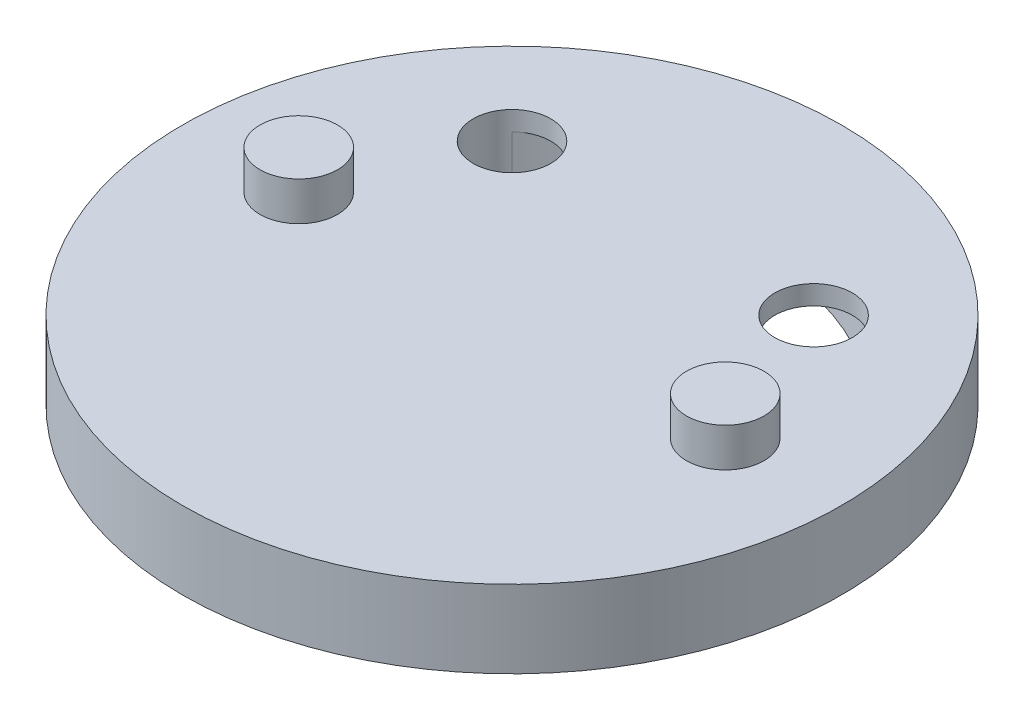
ISO-10303-21;
HEADER;
FILE_DESCRIPTION(('STEP AP214'),'2;1');
FILE_NAME('part.step','',(''),(''),'','','');
FILE_SCHEMA(('AUTOMOTIVE_DESIGN { 1 0 10303 214 1 1 1 1 }'));
ENDSEC;
DATA;
#1=APPLICATION_CONTEXT('core data for automotive mechanical design processes');
#2=APPLICATION_PROTOCOL_DEFINITION('international standard','automotive_design',2000,#1);
#3=PRODUCT_CONTEXT('',#1,'mechanical');
#4=PRODUCT('Part','Part','',(#3));
#5=PRODUCT_RELATED_PRODUCT_CATEGORY('part','',(#4));
#6=PRODUCT_DEFINITION_FORMATION('','',#4);
#7=PRODUCT_DEFINITION_CONTEXT('part definition',#1,'design');
#8=PRODUCT_DEFINITION('design','',#6,#7);
#9=PRODUCT_DEFINITION_SHAPE('','',#8);
#10=(LENGTH_UNIT() NAMED_UNIT(*) SI_UNIT(.MILLI.,.METRE.));
#11=(NAMED_UNIT(*) PLANE_ANGLE_UNIT() SI_UNIT($,.RADIAN.));
#12=(NAMED_UNIT(*) SI_UNIT($,.STERADIAN.) SOLID_ANGLE_UNIT());
#13=UNCERTAINTY_MEASURE_WITH_UNIT(LENGTH_MEASURE(1.E-05),#10,'distance_accuracy_value','');
#14=(GEOMETRIC_REPRESENTATION_CONTEXT(3) GLOBAL_UNCERTAINTY_ASSIGNED_CONTEXT((#13)) GLOBAL_UNIT_ASSIGNED_CONTEXT((#10,
#11,#12)) REPRESENTATION_CONTEXT('',''));
#15=CARTESIAN_POINT('',(0.,0.,0.));
#16=DIRECTION('',(0.,0.,1.));
#17=DIRECTION('',(1.,0.,0.));
#18=AXIS2_PLACEMENT_3D('',#15,#16,#17);
#19=CARTESIAN_POINT('',(0.,0.,0.));
#20=DIRECTION('',(0.,1.,0.));
#21=DIRECTION('',(0.,0.,1.));
#22=AXIS2_PLACEMENT_3D('',#19,#20,#21);
#23=PLANE('',#22);
#24=CARTESIAN_POINT('',(0.,0.,0.));
#25=DIRECTION('',(0.,1.,0.));
#26=DIRECTION('',(0.,0.,1.));
#27=AXIS2_PLACEMENT_3D('',#24,#25,#26);
#28=CIRCLE('',#27,17.);
#29=CARTESIAN_POINT('',(0.,0.,17.));
#30=VERTEX_POINT('',#29);
#31=EDGE_CURVE('E173',#30,#30,#28,.T.);
#32=ORIENTED_EDGE('',*,*,#31,.F.);
#33=EDGE_LOOP('',(#32));
#34=FACE_BOUND('',#33,.T.);
#35=CARTESIAN_POINT('',(0.,0.,0.));
#36=DIRECTION('',(0.,1.,0.));
#37=DIRECTION('',(0.,0.,1.));
#38=AXIS2_PLACEMENT_3D('',#35,#36,#37);
#39=CIRCLE('',#38,9.);
#40=CARTESIAN_POINT('',(-6.36396103067892,0.,6.36396103067893));
#41=VERTEX_POINT('',#40);
#42=CARTESIAN_POINT('',(6.36396103067892,0.,6.36396103067893));
#43=VERTEX_POINT('',#42);
#44=EDGE_CURVE('E142',#41,#43,#39,.T.);
#45=ORIENTED_EDGE('',*,*,#44,.F.);
#46=CARTESIAN_POINT('',(-7.77817459305201,0.,7.77817459305203));
#47=DIRECTION('',(0.,-1.,0.));
#48=DIRECTION('',(0.,0.,1.));
#49=AXIS2_PLACEMENT_3D('',#46,#47,#48);
#50=CIRCLE('',#49,2.);
#51=CARTESIAN_POINT('',(-9.19238815542511,0.,9.19238815542512));
#52=VERTEX_POINT('',#51);
#53=EDGE_CURVE('E62',#52,#41,#50,.T.);
#54=ORIENTED_EDGE('',*,*,#53,.F.);
#55=CARTESIAN_POINT('',(0.,0.,0.));
#56=DIRECTION('',(0.,-1.,0.));
#57=DIRECTION('',(0.,0.,1.));
#58=AXIS2_PLACEMENT_3D('',#55,#56,#57);
#59=CIRCLE('',#58,13.);
#60=CARTESIAN_POINT('',(9.1923881554251,0.,9.19238815542514));
#61=VERTEX_POINT('',#60);
#62=EDGE_CURVE('E131',#61,#52,#59,.T.);
#63=ORIENTED_EDGE('',*,*,#62,.F.);
#64=CARTESIAN_POINT('',(7.77817459305201,0.,7.77817459305203));
#65=DIRECTION('',(0.,-1.,0.));
#66=DIRECTION('',(0.,0.,1.));
#67=AXIS2_PLACEMENT_3D('',#64,#65,#66);
#68=CIRCLE('',#67,2.);
#69=EDGE_CURVE('E145',#43,#61,#68,.T.);
#70=ORIENTED_EDGE('',*,*,#69,.F.);
#71=EDGE_LOOP('',(#45,#54,#63,#70));
#72=FACE_BOUND('',#71,.T.);
#73=CARTESIAN_POINT('',(0.,0.,0.));
#74=DIRECTION('',(0.,-1.,0.));
#75=DIRECTION('',(0.,0.,-1.));
#76=AXIS2_PLACEMENT_3D('',#73,#74,#75);
#77=CIRCLE('',#76,13.);
#78=CARTESIAN_POINT('',(-9.19238815542511,0.,-9.19238815542512));
#79=VERTEX_POINT('',#78);
#80=CARTESIAN_POINT('',(9.1923881554251,0.,-9.19238815542514));
#81=VERTEX_POINT('',#80);
#82=EDGE_CURVE('E217',#79,#81,#77,.T.);
#83=ORIENTED_EDGE('',*,*,#82,.F.);
#84=CARTESIAN_POINT('',(-7.77817459305201,0.,-7.77817459305203));
#85=DIRECTION('',(0.,-1.,0.));
#86=DIRECTION('',(0.,0.,-1.));
#87=AXIS2_PLACEMENT_3D('',#84,#85,#86);
#88=CIRCLE('',#87,2.);
#89=CARTESIAN_POINT('',(-6.36396103067892,0.,-6.36396103067893));
#90=VERTEX_POINT('',#89);
#91=EDGE_CURVE('E119',#90,#79,#88,.T.);
#92=ORIENTED_EDGE('',*,*,#91,.F.);
#93=CARTESIAN_POINT('',(0.,0.,0.));
#94=DIRECTION('',(0.,1.,0.));
#95=DIRECTION('',(0.,0.,-1.));
#96=AXIS2_PLACEMENT_3D('',#93,#94,#95);
#97=CIRCLE('',#96,9.);
#98=CARTESIAN_POINT('',(6.36396103067892,0.,-6.36396103067893));
#99=VERTEX_POINT('',#98);
#100=EDGE_CURVE('E114',#99,#90,#97,.T.);
#101=ORIENTED_EDGE('',*,*,#100,.F.);
#102=CARTESIAN_POINT('',(7.77817459305201,0.,-7.77817459305203));
#103=DIRECTION('',(0.,-1.,0.));
#104=DIRECTION('',(0.,0.,-1.));
#105=AXIS2_PLACEMENT_3D('',#102,#103,#104);
#106=CIRCLE('',#105,2.);
#107=EDGE_CURVE('E220',#81,#99,#106,.T.);
#108=ORIENTED_EDGE('',*,*,#107,.F.);
#109=EDGE_LOOP('',(#83,#92,#101,#108));
#110=FACE_BOUND('',#109,.T.);
#111=ADVANCED_FACE('F39',(#34,#72,#110),#23,.F.);
#112=CARTESIAN_POINT('',(0.,4.,0.));
#113=DIRECTION('',(0.,1.,0.));
#114=DIRECTION('',(0.,0.,1.));
#115=AXIS2_PLACEMENT_3D('',#112,#113,#114);
#116=PLANE('',#115);
#117=CARTESIAN_POINT('',(-11.,4.,0.));
#118=DIRECTION('',(0.,1.,0.));
#119=DIRECTION('',(0.,0.,1.));
#120=AXIS2_PLACEMENT_3D('',#117,#118,#119);
#121=CIRCLE('',#120,2.);
#122=CARTESIAN_POINT('',(-11.,4.,2.));
#123=VERTEX_POINT('',#122);
#124=EDGE_CURVE('E159',#123,#123,#121,.T.);
#125=ORIENTED_EDGE('',*,*,#124,.F.);
#126=EDGE_LOOP('',(#125));
#127=FACE_BOUND('',#126,.T.);
#128=CARTESIAN_POINT('',(11.,4.,0.));
#129=DIRECTION('',(0.,1.,0.));
#130=DIRECTION('',(0.,0.,1.));
#131=AXIS2_PLACEMENT_3D('',#128,#129,#130);
#132=CIRCLE('',#131,2.);
#133=CARTESIAN_POINT('',(11.,4.,2.));
#134=VERTEX_POINT('',#133);
#135=EDGE_CURVE('E47',#134,#134,#132,.T.);
#136=ORIENTED_EDGE('',*,*,#135,.F.);
#137=EDGE_LOOP('',(#136));
#138=FACE_BOUND('',#137,.T.);
#139=CARTESIAN_POINT('',(7.77817459305201,4.,-7.77817459305203));
#140=DIRECTION('',(0.,1.,0.));
#141=DIRECTION('',(0.,0.,1.));
#142=AXIS2_PLACEMENT_3D('',#139,#140,#141);
#143=CIRCLE('',#142,2.);
#144=CARTESIAN_POINT('',(7.77817459305201,4.,-5.77817459305203));
#145=VERTEX_POINT('',#144);
#146=EDGE_CURVE('E169',#145,#145,#143,.F.);
#147=ORIENTED_EDGE('',*,*,#146,.T.);
#148=EDGE_LOOP('',(#147));
#149=FACE_BOUND('',#148,.T.);
#150=CARTESIAN_POINT('',(0.,4.,0.));
#151=DIRECTION('',(0.,1.,0.));
#152=DIRECTION('',(0.,0.,1.));
#153=AXIS2_PLACEMENT_3D('',#150,#151,#152);
#154=CIRCLE('',#153,17.);
#155=CARTESIAN_POINT('',(0.,4.,17.));
#156=VERTEX_POINT('',#155);
#157=EDGE_CURVE('E176',#156,#156,#154,.T.);
#158=ORIENTED_EDGE('',*,*,#157,.T.);
#159=EDGE_LOOP('',(#158));
#160=FACE_BOUND('',#159,.T.);
#161=CARTESIAN_POINT('',(-7.77817459305201,4.,-7.77817459305203));
#162=DIRECTION('',(0.,1.,0.));
#163=DIRECTION('',(0.,0.,1.));
#164=AXIS2_PLACEMENT_3D('',#161,#162,#163);
#165=CIRCLE('',#164,2.);
#166=CARTESIAN_POINT('',(-7.77817459305201,4.,-5.77817459305203));
#167=VERTEX_POINT('',#166);
#168=EDGE_CURVE('E170',#167,#167,#165,.T.);
#169=ORIENTED_EDGE('',*,*,#168,.F.);
#170=EDGE_LOOP('',(#169));
#171=FACE_BOUND('',#170,.T.);
#172=ADVANCED_FACE('F185',(#127,#138,#149,#160,#171),#116,.T.);
#173=CARTESIAN_POINT('',(0.,4.,0.));
#174=DIRECTION('',(0.,-1.,0.));
#175=DIRECTION('',(0.,0.,-1.));
#176=AXIS2_PLACEMENT_3D('',#173,#174,#175);
#177=CYLINDRICAL_SURFACE('',#176,17.);
#178=ORIENTED_EDGE('',*,*,#157,.F.);
#179=EDGE_LOOP('',(#178));
#180=FACE_BOUND('',#179,.T.);
#181=ORIENTED_EDGE('',*,*,#31,.T.);
#182=EDGE_LOOP('',(#181));
#183=FACE_BOUND('',#182,.T.);
#184=ADVANCED_FACE('F41',(#180,#183),#177,.T.);
#185=CARTESIAN_POINT('',(7.77817459305201,1.,-7.77817459305203));
#186=DIRECTION('',(0.,1.,0.));
#187=DIRECTION('',(0.,0.,1.));
#188=AXIS2_PLACEMENT_3D('',#185,#186,#187);
#189=CYLINDRICAL_SURFACE('',#188,2.);
#190=DIRECTION('',(0.,-1.,0.));
#191=VECTOR('',#190,1.);
#192=CARTESIAN_POINT('',(6.36396103067892,3.,-6.36396103067893));
#193=LINE('',#192,#191);
#194=CARTESIAN_POINT('',(6.36396103067892,3.,-6.36396103067893));
#195=VERTEX_POINT('',#194);
#196=EDGE_CURVE('E122',#195,#99,#193,.T.);
#197=ORIENTED_EDGE('',*,*,#196,.F.);
#198=CARTESIAN_POINT('',(7.77817459305201,3.,-7.77817459305203));
#199=DIRECTION('',(0.,-1.,0.));
#200=DIRECTION('',(0.,0.,-1.));
#201=AXIS2_PLACEMENT_3D('',#198,#199,#200);
#202=CIRCLE('',#201,2.);
#203=CARTESIAN_POINT('',(9.1923881554251,3.,-9.19238815542514));
#204=VERTEX_POINT('',#203);
#205=EDGE_CURVE('E157',#195,#204,#202,.T.);
#206=ORIENTED_EDGE('',*,*,#205,.T.);
#207=DIRECTION('',(0.,-1.,0.));
#208=VECTOR('',#207,1.);
#209=CARTESIAN_POINT('',(9.1923881554251,3.,-9.19238815542514));
#210=LINE('',#209,#208);
#211=EDGE_CURVE('E113',#204,#81,#210,.T.);
#212=ORIENTED_EDGE('',*,*,#211,.T.);
#213=ORIENTED_EDGE('',*,*,#107,.T.);
#214=EDGE_LOOP('',(#197,#206,#212,#213));
#215=FACE_BOUND('',#214,.T.);
#216=ORIENTED_EDGE('',*,*,#146,.F.);
#217=EDGE_LOOP('',(#216));
#218=FACE_BOUND('',#217,.T.);
#219=ADVANCED_FACE('F196',(#215,#218),#189,.F.);
#220=CARTESIAN_POINT('',(-7.77817459305201,1.,-7.77817459305203));
#221=DIRECTION('',(0.,1.,0.));
#222=DIRECTION('',(0.,0.,1.));
#223=AXIS2_PLACEMENT_3D('',#220,#221,#222);
#224=CYLINDRICAL_SURFACE('',#223,2.);
#225=DIRECTION('',(0.,-1.,0.));
#226=VECTOR('',#225,1.);
#227=CARTESIAN_POINT('',(-9.19238815542511,3.,-9.19238815542512));
#228=LINE('',#227,#226);
#229=CARTESIAN_POINT('',(-9.19238815542511,3.,-9.19238815542512));
#230=VERTEX_POINT('',#229);
#231=EDGE_CURVE('E54',#230,#79,#228,.T.);
#232=ORIENTED_EDGE('',*,*,#231,.F.);
#233=CARTESIAN_POINT('',(-7.77817459305201,3.,-7.77817459305203));
#234=DIRECTION('',(0.,-1.,0.));
#235=DIRECTION('',(0.,0.,-1.));
#236=AXIS2_PLACEMENT_3D('',#233,#234,#235);
#237=CIRCLE('',#236,2.);
#238=CARTESIAN_POINT('',(-6.36396103067892,3.,-6.36396103067893));
#239=VERTEX_POINT('',#238);
#240=EDGE_CURVE('E12',#239,#230,#237,.F.);
#241=ORIENTED_EDGE('',*,*,#240,.F.);
#242=DIRECTION('',(0.,-1.,0.));
#243=VECTOR('',#242,1.);
#244=CARTESIAN_POINT('',(-6.36396103067892,3.,-6.36396103067893));
#245=LINE('',#244,#243);
#246=EDGE_CURVE('E160',#239,#90,#245,.T.);
#247=ORIENTED_EDGE('',*,*,#246,.T.);
#248=ORIENTED_EDGE('',*,*,#91,.T.);
#249=EDGE_LOOP('',(#232,#241,#247,#248));
#250=FACE_BOUND('',#249,.T.);
#251=ORIENTED_EDGE('',*,*,#168,.T.);
#252=EDGE_LOOP('',(#251));
#253=FACE_BOUND('',#252,.T.);
#254=ADVANCED_FACE('F116',(#250,#253),#224,.F.);
#255=CARTESIAN_POINT('',(11.,6.,0.));
#256=DIRECTION('',(0.,-1.,0.));
#257=DIRECTION('',(0.,0.,-1.));
#258=AXIS2_PLACEMENT_3D('',#255,#256,#257);
#259=CYLINDRICAL_SURFACE('',#258,2.);
#260=CARTESIAN_POINT('',(11.,6.,0.));
#261=DIRECTION('',(0.,1.,0.));
#262=DIRECTION('',(0.,0.,1.));
#263=AXIS2_PLACEMENT_3D('',#260,#261,#262);
#264=CIRCLE('',#263,2.);
#265=CARTESIAN_POINT('',(11.,6.,2.));
#266=VERTEX_POINT('',#265);
#267=EDGE_CURVE('E164',#266,#266,#264,.F.);
#268=ORIENTED_EDGE('',*,*,#267,.T.);
#269=EDGE_LOOP('',(#268));
#270=FACE_BOUND('',#269,.T.);
#271=ORIENTED_EDGE('',*,*,#135,.T.);
#272=EDGE_LOOP('',(#271));
#273=FACE_BOUND('',#272,.T.);
#274=ADVANCED_FACE('F183',(#270,#273),#259,.T.);
#275=CARTESIAN_POINT('',(0.,6.,0.));
#276=DIRECTION('',(0.,1.,0.));
#277=DIRECTION('',(0.,0.,1.));
#278=AXIS2_PLACEMENT_3D('',#275,#276,#277);
#279=PLANE('',#278);
#280=ORIENTED_EDGE('',*,*,#267,.F.);
#281=EDGE_LOOP('',(#280));
#282=FACE_BOUND('',#281,.T.);
#283=ADVANCED_FACE('F202',(#282),#279,.T.);
#284=CARTESIAN_POINT('',(-11.,6.,0.));
#285=DIRECTION('',(0.,-1.,0.));
#286=DIRECTION('',(0.,0.,-1.));
#287=AXIS2_PLACEMENT_3D('',#284,#285,#286);
#288=CYLINDRICAL_SURFACE('',#287,2.);
#289=CARTESIAN_POINT('',(-11.,6.,0.));
#290=DIRECTION('',(0.,1.,0.));
#291=DIRECTION('',(0.,0.,1.));
#292=AXIS2_PLACEMENT_3D('',#289,#290,#291);
#293=CIRCLE('',#292,2.);
#294=CARTESIAN_POINT('',(-11.,6.,2.));
#295=VERTEX_POINT('',#294);
#296=EDGE_CURVE('E161',#295,#295,#293,.T.);
#297=ORIENTED_EDGE('',*,*,#296,.F.);
#298=EDGE_LOOP('',(#297));
#299=FACE_BOUND('',#298,.T.);
#300=ORIENTED_EDGE('',*,*,#124,.T.);
#301=EDGE_LOOP('',(#300));
#302=FACE_BOUND('',#301,.T.);
#303=ADVANCED_FACE('F262',(#299,#302),#288,.T.);
#304=CARTESIAN_POINT('',(0.,6.,0.));
#305=DIRECTION('',(0.,1.,0.));
#306=DIRECTION('',(0.,0.,1.));
#307=AXIS2_PLACEMENT_3D('',#304,#305,#306);
#308=PLANE('',#307);
#309=ORIENTED_EDGE('',*,*,#296,.T.);
#310=EDGE_LOOP('',(#309));
#311=FACE_BOUND('',#310,.T.);
#312=ADVANCED_FACE('F239',(#311),#308,.T.);
#313=CARTESIAN_POINT('',(-3.88908729652601,3.,-3.88908729652602));
#314=DIRECTION('',(0.,-1.,0.));
#315=DIRECTION('',(0.,0.,-1.));
#316=AXIS2_PLACEMENT_3D('',#313,#314,#315);
#317=PLANE('',#316);
#318=CARTESIAN_POINT('',(0.,3.,0.));
#319=DIRECTION('',(0.,1.,0.));
#320=DIRECTION('',(0.,0.,-1.));
#321=AXIS2_PLACEMENT_3D('',#318,#319,#320);
#322=CIRCLE('',#321,9.);
#323=EDGE_CURVE('E110',#195,#239,#322,.T.);
#324=ORIENTED_EDGE('',*,*,#323,.T.);
#325=ORIENTED_EDGE('',*,*,#240,.T.);
#326=CARTESIAN_POINT('',(0.,3.,0.));
#327=DIRECTION('',(0.,-1.,0.));
#328=DIRECTION('',(0.,0.,-1.));
#329=AXIS2_PLACEMENT_3D('',#326,#327,#328);
#330=CIRCLE('',#329,13.);
#331=EDGE_CURVE('E107',#230,#204,#330,.T.);
#332=ORIENTED_EDGE('',*,*,#331,.T.);
#333=ORIENTED_EDGE('',*,*,#205,.F.);
#334=EDGE_LOOP('',(#324,#325,#332,#333));
#335=FACE_BOUND('',#334,.T.);
#336=ADVANCED_FACE('F106',(#335),#317,.T.);
#337=CARTESIAN_POINT('',(0.,3.,0.));
#338=DIRECTION('',(0.,-1.,0.));
#339=DIRECTION('',(0.,0.,-1.));
#340=AXIS2_PLACEMENT_3D('',#337,#338,#339);
#341=CYLINDRICAL_SURFACE('',#340,9.);
#342=ORIENTED_EDGE('',*,*,#100,.T.);
#343=ORIENTED_EDGE('',*,*,#246,.F.);
#344=ORIENTED_EDGE('',*,*,#323,.F.);
#345=ORIENTED_EDGE('',*,*,#196,.T.);
#346=EDGE_LOOP('',(#342,#343,#344,#345));
#347=FACE_BOUND('',#346,.T.);
#348=ADVANCED_FACE('F229',(#347),#341,.T.);
#349=CARTESIAN_POINT('',(0.,3.,0.));
#350=DIRECTION('',(0.,-1.,0.));
#351=DIRECTION('',(0.,0.,-1.));
#352=AXIS2_PLACEMENT_3D('',#349,#350,#351);
#353=CYLINDRICAL_SURFACE('',#352,13.);
#354=ORIENTED_EDGE('',*,*,#82,.T.);
#355=ORIENTED_EDGE('',*,*,#211,.F.);
#356=ORIENTED_EDGE('',*,*,#331,.F.);
#357=ORIENTED_EDGE('',*,*,#231,.T.);
#358=EDGE_LOOP('',(#354,#355,#356,#357));
#359=FACE_BOUND('',#358,.T.);
#360=ADVANCED_FACE('F112',(#359),#353,.F.);
#361=CARTESIAN_POINT('',(-7.77817459305201,3.,7.77817459305203));
#362=DIRECTION('',(0.,-1.,0.));
#363=DIRECTION('',(0.,0.,-1.));
#364=AXIS2_PLACEMENT_3D('',#361,#362,#363);
#365=CYLINDRICAL_SURFACE('',#364,2.);
#366=ORIENTED_EDGE('',*,*,#53,.T.);
#367=DIRECTION('',(0.,-1.,0.));
#368=VECTOR('',#367,1.);
#369=CARTESIAN_POINT('',(-6.36396103067892,3.,6.36396103067893));
#370=LINE('',#369,#368);
#371=CARTESIAN_POINT('',(-6.36396103067892,3.,6.36396103067893));
#372=VERTEX_POINT('',#371);
#373=EDGE_CURVE('E140',#372,#41,#370,.T.);
#374=ORIENTED_EDGE('',*,*,#373,.F.);
#375=CARTESIAN_POINT('',(-7.77817459305201,3.,7.77817459305203));
#376=DIRECTION('',(0.,-1.,0.));
#377=DIRECTION('',(0.,0.,1.));
#378=AXIS2_PLACEMENT_3D('',#375,#376,#377);
#379=CIRCLE('',#378,2.);
#380=CARTESIAN_POINT('',(-9.19238815542511,3.,9.19238815542512));
#381=VERTEX_POINT('',#380);
#382=EDGE_CURVE('E127',#381,#372,#379,.T.);
#383=ORIENTED_EDGE('',*,*,#382,.F.);
#384=DIRECTION('',(0.,-1.,0.));
#385=VECTOR('',#384,1.);
#386=CARTESIAN_POINT('',(-9.19238815542511,3.,9.19238815542512));
#387=LINE('',#386,#385);
#388=EDGE_CURVE('E150',#381,#52,#387,.T.);
#389=ORIENTED_EDGE('',*,*,#388,.T.);
#390=EDGE_LOOP('',(#366,#374,#383,#389));
#391=FACE_BOUND('',#390,.T.);
#392=ADVANCED_FACE('F237',(#391),#365,.F.);
#393=CARTESIAN_POINT('',(0.,3.,0.));
#394=DIRECTION('',(0.,-1.,0.));
#395=DIRECTION('',(0.,0.,-1.));
#396=AXIS2_PLACEMENT_3D('',#393,#394,#395);
#397=CYLINDRICAL_SURFACE('',#396,13.);
#398=ORIENTED_EDGE('',*,*,#62,.T.);
#399=ORIENTED_EDGE('',*,*,#388,.F.);
#400=CARTESIAN_POINT('',(0.,3.,0.));
#401=DIRECTION('',(0.,-1.,0.));
#402=DIRECTION('',(0.,0.,1.));
#403=AXIS2_PLACEMENT_3D('',#400,#401,#402);
#404=CIRCLE('',#403,13.);
#405=CARTESIAN_POINT('',(9.1923881554251,3.,9.19238815542514));
#406=VERTEX_POINT('',#405);
#407=EDGE_CURVE('E137',#406,#381,#404,.T.);
#408=ORIENTED_EDGE('',*,*,#407,.F.);
#409=DIRECTION('',(0.,-1.,0.));
#410=VECTOR('',#409,1.);
#411=CARTESIAN_POINT('',(9.1923881554251,3.,9.19238815542514));
#412=LINE('',#411,#410);
#413=EDGE_CURVE('E152',#406,#61,#412,.T.);
#414=ORIENTED_EDGE('',*,*,#413,.T.);
#415=EDGE_LOOP('',(#398,#399,#408,#414));
#416=FACE_BOUND('',#415,.T.);
#417=ADVANCED_FACE('F247',(#416),#397,.F.);
#418=CARTESIAN_POINT('',(7.77817459305201,3.,7.77817459305203));
#419=DIRECTION('',(0.,-1.,0.));
#420=DIRECTION('',(0.,0.,-1.));
#421=AXIS2_PLACEMENT_3D('',#418,#419,#420);
#422=CYLINDRICAL_SURFACE('',#421,2.);
#423=ORIENTED_EDGE('',*,*,#69,.T.);
#424=ORIENTED_EDGE('',*,*,#413,.F.);
#425=CARTESIAN_POINT('',(7.77817459305201,3.,7.77817459305203));
#426=DIRECTION('',(0.,-1.,0.));
#427=DIRECTION('',(0.,0.,1.));
#428=AXIS2_PLACEMENT_3D('',#425,#426,#427);
#429=CIRCLE('',#428,2.);
#430=CARTESIAN_POINT('',(6.36396103067892,3.,6.36396103067893));
#431=VERTEX_POINT('',#430);
#432=EDGE_CURVE('E134',#431,#406,#429,.T.);
#433=ORIENTED_EDGE('',*,*,#432,.F.);
#434=DIRECTION('',(0.,-1.,0.));
#435=VECTOR('',#434,1.);
#436=CARTESIAN_POINT('',(6.36396103067892,3.,6.36396103067893));
#437=LINE('',#436,#435);
#438=EDGE_CURVE('E154',#431,#43,#437,.T.);
#439=ORIENTED_EDGE('',*,*,#438,.T.);
#440=EDGE_LOOP('',(#423,#424,#433,#439));
#441=FACE_BOUND('',#440,.T.);
#442=ADVANCED_FACE('F250',(#441),#422,.F.);
#443=CARTESIAN_POINT('',(0.,3.,0.));
#444=DIRECTION('',(0.,-1.,0.));
#445=DIRECTION('',(0.,0.,-1.));
#446=AXIS2_PLACEMENT_3D('',#443,#444,#445);
#447=CYLINDRICAL_SURFACE('',#446,9.);
#448=ORIENTED_EDGE('',*,*,#44,.T.);
#449=ORIENTED_EDGE('',*,*,#438,.F.);
#450=CARTESIAN_POINT('',(0.,3.,0.));
#451=DIRECTION('',(0.,1.,0.));
#452=DIRECTION('',(0.,0.,1.));
#453=AXIS2_PLACEMENT_3D('',#450,#451,#452);
#454=CIRCLE('',#453,9.);
#455=EDGE_CURVE('E130',#372,#431,#454,.T.);
#456=ORIENTED_EDGE('',*,*,#455,.F.);
#457=ORIENTED_EDGE('',*,*,#373,.T.);
#458=EDGE_LOOP('',(#448,#449,#456,#457));
#459=FACE_BOUND('',#458,.T.);
#460=ADVANCED_FACE('F245',(#459),#447,.T.);
#461=CARTESIAN_POINT('',(-3.88908729652601,3.,3.88908729652602));
#462=DIRECTION('',(0.,1.,0.));
#463=DIRECTION('',(0.,0.,1.));
#464=AXIS2_PLACEMENT_3D('',#461,#462,#463);
#465=PLANE('',#464);
#466=ORIENTED_EDGE('',*,*,#382,.T.);
#467=ORIENTED_EDGE('',*,*,#455,.T.);
#468=ORIENTED_EDGE('',*,*,#432,.T.);
#469=ORIENTED_EDGE('',*,*,#407,.T.);
#470=EDGE_LOOP('',(#466,#467,#468,#469));
#471=FACE_BOUND('',#470,.T.);
#472=ADVANCED_FACE('F242',(#471),#465,.F.);
#473=CLOSED_SHELL('',(#111,#172,#184,#219,#254,#274,#283,#303,#312,#336,#348,#360,#392,#417,
#442,#460,#472));
#474=MANIFOLD_SOLID_BREP('B2',#473);
#475=ADVANCED_BREP_SHAPE_REPRESENTATION('',(#18,#474),#14);
#476=SHAPE_DEFINITION_REPRESENTATION(#9,#475);
ENDSEC;
END-ISO-10303-21;
